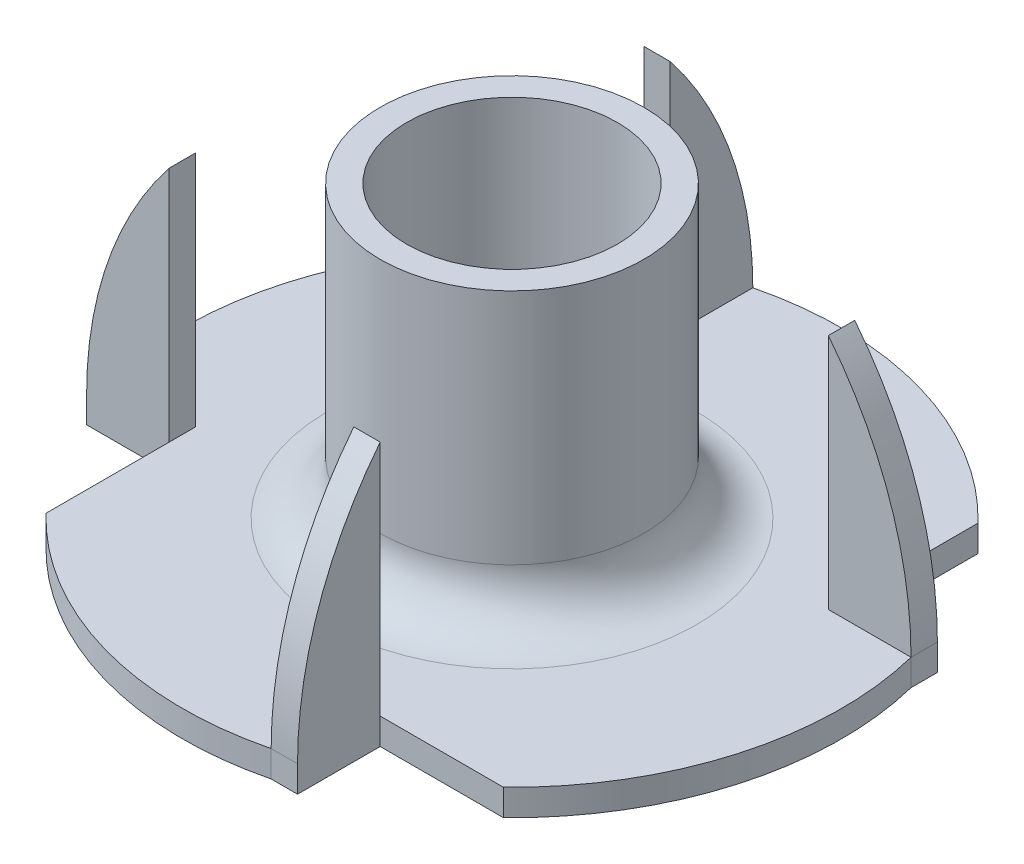
ISO-10303-21;
HEADER;
FILE_DESCRIPTION(('STEP AP214'),'2;1');
FILE_NAME('part.step','',(''),(''),'','','');
FILE_SCHEMA(('AUTOMOTIVE_DESIGN { 1 0 10303 214 1 1 1 1 }'));
ENDSEC;
DATA;
#1=APPLICATION_CONTEXT('core data for automotive mechanical design processes');
#2=APPLICATION_PROTOCOL_DEFINITION('international standard','automotive_design',2000,#1);
#3=PRODUCT_CONTEXT('',#1,'mechanical');
#4=PRODUCT('Part','Part','',(#3));
#5=PRODUCT_RELATED_PRODUCT_CATEGORY('part','',(#4));
#6=PRODUCT_DEFINITION_FORMATION('','',#4);
#7=PRODUCT_DEFINITION_CONTEXT('part definition',#1,'design');
#8=PRODUCT_DEFINITION('design','',#6,#7);
#9=PRODUCT_DEFINITION_SHAPE('','',#8);
#10=(LENGTH_UNIT() NAMED_UNIT(*) SI_UNIT(.MILLI.,.METRE.));
#11=(NAMED_UNIT(*) PLANE_ANGLE_UNIT() SI_UNIT($,.RADIAN.));
#12=(NAMED_UNIT(*) SI_UNIT($,.STERADIAN.) SOLID_ANGLE_UNIT());
#13=UNCERTAINTY_MEASURE_WITH_UNIT(LENGTH_MEASURE(1.E-05),#10,'distance_accuracy_value','');
#14=(GEOMETRIC_REPRESENTATION_CONTEXT(3) GLOBAL_UNCERTAINTY_ASSIGNED_CONTEXT((#13)) GLOBAL_UNIT_ASSIGNED_CONTEXT((#10,
#11,#12)) REPRESENTATION_CONTEXT('',''));
#15=CARTESIAN_POINT('',(0.,0.,0.));
#16=DIRECTION('',(0.,0.,1.));
#17=DIRECTION('',(1.,0.,0.));
#18=AXIS2_PLACEMENT_3D('',#15,#16,#17);
#19=CARTESIAN_POINT('',(0.,1.,-7.));
#20=DIRECTION('',(0.,-1.,0.));
#21=DIRECTION('',(0.,0.,-1.));
#22=AXIS2_PLACEMENT_3D('',#19,#20,#21);
#23=PLANE('',#22);
#24=CARTESIAN_POINT('',(0.,1.,0.));
#25=DIRECTION('',(0.,1.,0.));
#26=DIRECTION('',(0.,0.,1.));
#27=AXIS2_PLACEMENT_3D('',#24,#25,#26);
#28=CIRCLE('',#27,7.);
#29=CARTESIAN_POINT('',(0.,1.,7.));
#30=VERTEX_POINT('',#29);
#31=EDGE_CURVE('E431',#30,#30,#28,.T.);
#32=ORIENTED_EDGE('',*,*,#31,.F.);
#33=EDGE_LOOP('',(#32));
#34=FACE_BOUND('',#33,.T.);
#35=DIRECTION('',(0.,0.,1.));
#36=VECTOR('',#35,1.);
#37=CARTESIAN_POINT('',(8.99999999999975,1.,-2.99999999999987));
#38=LINE('',#37,#36);
#39=CARTESIAN_POINT('',(8.99999999999975,1.,-8.674675786449));
#40=VERTEX_POINT('',#39);
#41=CARTESIAN_POINT('',(8.99999999999975,1.,-4.00000000000013));
#42=VERTEX_POINT('',#41);
#43=EDGE_CURVE('E343',#40,#42,#38,.T.);
#44=ORIENTED_EDGE('',*,*,#43,.F.);
#45=CARTESIAN_POINT('',(0.,1.,0.));
#46=DIRECTION('',(0.,1.,0.));
#47=DIRECTION('',(0.,0.,1.));
#48=AXIS2_PLACEMENT_3D('',#45,#46,#47);
#49=CIRCLE('',#48,12.5);
#50=CARTESIAN_POINT('',(-3.00000000000009,1.,-12.1346610995121));
#51=VERTEX_POINT('',#50);
#52=EDGE_CURVE('E483',#40,#51,#49,.T.);
#53=ORIENTED_EDGE('',*,*,#52,.T.);
#54=DIRECTION('',(0.,0.,-1.));
#55=VECTOR('',#54,1.);
#56=CARTESIAN_POINT('',(-3.00000000000025,1.,-12.1346610995117));
#57=LINE('',#56,#55);
#58=CARTESIAN_POINT('',(-3.00000000000025,1.,-8.99999999999986));
#59=VERTEX_POINT('',#58);
#60=EDGE_CURVE('E413',#59,#51,#57,.T.);
#61=ORIENTED_EDGE('',*,*,#60,.F.);
#62=DIRECTION('',(1.,0.,0.));
#63=VECTOR('',#62,1.);
#64=CARTESIAN_POINT('',(-3.00000000000025,1.,-8.99999999999986));
#65=LINE('',#64,#63);
#66=CARTESIAN_POINT('',(-4.00000000000009,1.,-8.99999999999986));
#67=VERTEX_POINT('',#66);
#68=EDGE_CURVE('E67',#67,#59,#65,.T.);
#69=ORIENTED_EDGE('',*,*,#68,.F.);
#70=CARTESIAN_POINT('',(-8.67467578644938,1.,-8.99999999999986));
#71=VERTEX_POINT('',#70);
#72=EDGE_CURVE('E416',#71,#67,#65,.T.);
#73=ORIENTED_EDGE('',*,*,#72,.F.);
#74=CARTESIAN_POINT('',(-12.1346610995121,1.,3.00000000000013));
#75=VERTEX_POINT('',#74);
#76=EDGE_CURVE('E437',#71,#75,#49,.T.);
#77=ORIENTED_EDGE('',*,*,#76,.T.);
#78=DIRECTION('',(-1.,0.,0.));
#79=VECTOR('',#78,1.);
#80=CARTESIAN_POINT('',(-12.1346610995121,1.,3.00000000000014));
#81=LINE('',#80,#79);
#82=CARTESIAN_POINT('',(-9.00000000000025,1.,3.00000000000014));
#83=VERTEX_POINT('',#82);
#84=EDGE_CURVE('E394',#83,#75,#81,.T.);
#85=ORIENTED_EDGE('',*,*,#84,.F.);
#86=DIRECTION('',(0.,0.,-1.));
#87=VECTOR('',#86,1.);
#88=CARTESIAN_POINT('',(-9.00000000000025,1.,3.00000000000014));
#89=LINE('',#88,#87);
#90=CARTESIAN_POINT('',(-9.00000000000025,1.,4.00000000000013));
#91=VERTEX_POINT('',#90);
#92=EDGE_CURVE('E401',#91,#83,#89,.T.);
#93=ORIENTED_EDGE('',*,*,#92,.F.);
#94=CARTESIAN_POINT('',(-9.00000000000025,1.,8.67467578644927));
#95=VERTEX_POINT('',#94);
#96=EDGE_CURVE('E398',#95,#91,#89,.T.);
#97=ORIENTED_EDGE('',*,*,#96,.F.);
#98=CARTESIAN_POINT('',(3.,1.,12.1346610995122));
#99=VERTEX_POINT('',#98);
#100=EDGE_CURVE('E434',#95,#99,#49,.T.);
#101=ORIENTED_EDGE('',*,*,#100,.T.);
#102=DIRECTION('',(0.,0.,1.));
#103=VECTOR('',#102,1.);
#104=CARTESIAN_POINT('',(2.99999999999975,1.,12.134661099512));
#105=LINE('',#104,#103);
#106=CARTESIAN_POINT('',(2.99999999999975,1.,9.00000000000013));
#107=VERTEX_POINT('',#106);
#108=EDGE_CURVE('E376',#107,#99,#105,.T.);
#109=ORIENTED_EDGE('',*,*,#108,.F.);
#110=DIRECTION('',(-1.,0.,0.));
#111=VECTOR('',#110,1.);
#112=CARTESIAN_POINT('',(2.99999999999975,1.,9.00000000000013));
#113=LINE('',#112,#111);
#114=CARTESIAN_POINT('',(4.00000000000002,1.,9.00000000000013));
#115=VERTEX_POINT('',#114);
#116=EDGE_CURVE('E61',#115,#107,#113,.T.);
#117=ORIENTED_EDGE('',*,*,#116,.F.);
#118=CARTESIAN_POINT('',(8.67467578644888,1.,9.00000000000013));
#119=VERTEX_POINT('',#118);
#120=EDGE_CURVE('E379',#119,#115,#113,.T.);
#121=ORIENTED_EDGE('',*,*,#120,.F.);
#122=CARTESIAN_POINT('',(12.1346610995121,1.,-3.00000000000013));
#123=VERTEX_POINT('',#122);
#124=EDGE_CURVE('E438',#119,#123,#49,.T.);
#125=ORIENTED_EDGE('',*,*,#124,.T.);
#126=DIRECTION('',(1.,0.,0.));
#127=VECTOR('',#126,1.);
#128=CARTESIAN_POINT('',(12.1346610995116,1.,-2.99999999999987));
#129=LINE('',#128,#127);
#130=CARTESIAN_POINT('',(8.99999999999975,1.,-2.99999999999987));
#131=VERTEX_POINT('',#130);
#132=EDGE_CURVE('E346',#131,#123,#129,.T.);
#133=ORIENTED_EDGE('',*,*,#132,.F.);
#134=EDGE_CURVE('E349',#42,#131,#38,.T.);
#135=ORIENTED_EDGE('',*,*,#134,.F.);
#136=EDGE_LOOP('',(#44,#53,#61,#69,#73,#77,#85,#93,#97,#101,#109,#117,#121,#125,#133,#135));
#137=FACE_BOUND('',#136,.T.);
#138=ADVANCED_FACE('F44',(#34,#137),#23,.F.);
#139=CARTESIAN_POINT('',(0.,6.9664516560447,0.));
#140=DIRECTION('',(0.,1.,0.));
#141=DIRECTION('',(0.,0.,1.));
#142=AXIS2_PLACEMENT_3D('',#139,#140,#141);
#143=CYLINDRICAL_SURFACE('',#142,12.5);
#144=DIRECTION('',(0.,-1.,0.));
#145=VECTOR('',#144,1.);
#146=CARTESIAN_POINT('',(12.1346610995116,1.,-2.99999999999987));
#147=LINE('',#146,#145);
#148=CARTESIAN_POINT('',(12.1346610995116,0.,-2.99999999999987));
#149=VERTEX_POINT('',#148);
#150=EDGE_CURVE('E352',#123,#149,#147,.T.);
#151=ORIENTED_EDGE('',*,*,#150,.F.);
#152=ORIENTED_EDGE('',*,*,#124,.F.);
#153=DIRECTION('',(0.,-1.,0.));
#154=VECTOR('',#153,1.);
#155=CARTESIAN_POINT('',(8.67467578644888,1.,9.00000000000013));
#156=LINE('',#155,#154);
#157=CARTESIAN_POINT('',(8.67467578644888,0.,9.00000000000013));
#158=VERTEX_POINT('',#157);
#159=EDGE_CURVE('E370',#119,#158,#156,.T.);
#160=ORIENTED_EDGE('',*,*,#159,.T.);
#161=CARTESIAN_POINT('',(0.,0.,0.));
#162=DIRECTION('',(0.,1.,0.));
#163=DIRECTION('',(0.,0.,1.));
#164=AXIS2_PLACEMENT_3D('',#161,#162,#163);
#165=CIRCLE('',#164,12.5);
#166=EDGE_CURVE('E441',#158,#149,#165,.T.);
#167=ORIENTED_EDGE('',*,*,#166,.T.);
#168=EDGE_LOOP('',(#151,#152,#160,#167));
#169=FACE_BOUND('',#168,.T.);
#170=ADVANCED_FACE('F479',(#169),#143,.T.);
#171=DIRECTION('',(0.,-1.,0.));
#172=VECTOR('',#171,1.);
#173=CARTESIAN_POINT('',(2.99999999999975,1.,12.134661099512));
#174=LINE('',#173,#172);
#175=CARTESIAN_POINT('',(2.99999999999975,0.,12.134661099512));
#176=VERTEX_POINT('',#175);
#177=EDGE_CURVE('E371',#99,#176,#174,.T.);
#178=ORIENTED_EDGE('',*,*,#177,.F.);
#179=ORIENTED_EDGE('',*,*,#100,.F.);
#180=DIRECTION('',(0.,-1.,0.));
#181=VECTOR('',#180,1.);
#182=CARTESIAN_POINT('',(-9.00000000000025,1.,8.67467578644927));
#183=LINE('',#182,#181);
#184=CARTESIAN_POINT('',(-9.00000000000025,0.,8.67467578644927));
#185=VERTEX_POINT('',#184);
#186=EDGE_CURVE('E387',#95,#185,#183,.T.);
#187=ORIENTED_EDGE('',*,*,#186,.T.);
#188=EDGE_CURVE('E439',#185,#176,#165,.T.);
#189=ORIENTED_EDGE('',*,*,#188,.T.);
#190=EDGE_LOOP('',(#178,#179,#187,#189));
#191=FACE_BOUND('',#190,.T.);
#192=ADVANCED_FACE('F628',(#191),#143,.T.);
#193=DIRECTION('',(0.,-1.,0.));
#194=VECTOR('',#193,1.);
#195=CARTESIAN_POINT('',(-12.1346610995121,1.,3.00000000000014));
#196=LINE('',#195,#194);
#197=CARTESIAN_POINT('',(-12.1346610995121,0.,3.00000000000014));
#198=VERTEX_POINT('',#197);
#199=EDGE_CURVE('E388',#75,#198,#196,.T.);
#200=ORIENTED_EDGE('',*,*,#199,.F.);
#201=ORIENTED_EDGE('',*,*,#76,.F.);
#202=DIRECTION('',(0.,-1.,0.));
#203=VECTOR('',#202,1.);
#204=CARTESIAN_POINT('',(-8.67467578644938,1.,-8.99999999999986));
#205=LINE('',#204,#203);
#206=CARTESIAN_POINT('',(-8.67467578644938,0.,-8.99999999999986));
#207=VERTEX_POINT('',#206);
#208=EDGE_CURVE('E342',#71,#207,#205,.T.);
#209=ORIENTED_EDGE('',*,*,#208,.T.);
#210=EDGE_CURVE('E444',#207,#198,#165,.T.);
#211=ORIENTED_EDGE('',*,*,#210,.T.);
#212=EDGE_LOOP('',(#200,#201,#209,#211));
#213=FACE_BOUND('',#212,.T.);
#214=ADVANCED_FACE('F461',(#213),#143,.T.);
#215=CARTESIAN_POINT('',(0.,12.,-4.));
#216=DIRECTION('',(0.,-1.,0.));
#217=DIRECTION('',(0.,0.,-1.));
#218=AXIS2_PLACEMENT_3D('',#215,#216,#217);
#219=PLANE('',#218);
#220=CARTESIAN_POINT('',(0.,12.,0.));
#221=DIRECTION('',(0.,1.,0.));
#222=DIRECTION('',(0.,0.,1.));
#223=AXIS2_PLACEMENT_3D('',#220,#221,#222);
#224=CIRCLE('',#223,4.);
#225=CARTESIAN_POINT('',(0.,12.,4.));
#226=VERTEX_POINT('',#225);
#227=EDGE_CURVE('E11',#226,#226,#224,.T.);
#228=ORIENTED_EDGE('',*,*,#227,.F.);
#229=EDGE_LOOP('',(#228));
#230=FACE_BOUND('',#229,.T.);
#231=CARTESIAN_POINT('',(0.,12.,0.));
#232=DIRECTION('',(0.,1.,0.));
#233=DIRECTION('',(0.,0.,1.));
#234=AXIS2_PLACEMENT_3D('',#231,#232,#233);
#235=CIRCLE('',#234,5.);
#236=CARTESIAN_POINT('',(0.,12.,5.));
#237=VERTEX_POINT('',#236);
#238=EDGE_CURVE('E368',#237,#237,#235,.T.);
#239=ORIENTED_EDGE('',*,*,#238,.T.);
#240=EDGE_LOOP('',(#239));
#241=FACE_BOUND('',#240,.T.);
#242=ADVANCED_FACE('F50',(#230,#241),#219,.F.);
#243=CARTESIAN_POINT('',(0.,6.9664516560447,0.));
#244=DIRECTION('',(0.,1.,0.));
#245=DIRECTION('',(0.,0.,1.));
#246=AXIS2_PLACEMENT_3D('',#243,#244,#245);
#247=CYLINDRICAL_SURFACE('',#246,4.);
#248=CARTESIAN_POINT('',(0.,3.,0.));
#249=DIRECTION('',(0.,1.,0.));
#250=DIRECTION('',(0.,0.,1.));
#251=AXIS2_PLACEMENT_3D('',#248,#249,#250);
#252=CIRCLE('',#251,4.);
#253=CARTESIAN_POINT('',(0.,3.,4.));
#254=VERTEX_POINT('',#253);
#255=EDGE_CURVE('E53',#254,#254,#252,.T.);
#256=ORIENTED_EDGE('',*,*,#255,.F.);
#257=EDGE_LOOP('',(#256));
#258=FACE_BOUND('',#257,.T.);
#259=ORIENTED_EDGE('',*,*,#227,.T.);
#260=EDGE_LOOP('',(#259));
#261=FACE_BOUND('',#260,.T.);
#262=ADVANCED_FACE('F453',(#258,#261),#247,.F.);
#263=CARTESIAN_POINT('',(0.,3.,0.));
#264=DIRECTION('',(0.,1.,0.));
#265=DIRECTION('',(0.,0.,1.));
#266=AXIS2_PLACEMENT_3D('',#263,#264,#265);
#267=TOROIDAL_SURFACE('',#266,7.,3.);
#268=CARTESIAN_POINT('',(0.,0.,0.));
#269=DIRECTION('',(0.,1.,0.));
#270=DIRECTION('',(0.,0.,1.));
#271=AXIS2_PLACEMENT_3D('',#268,#269,#270);
#272=CIRCLE('',#271,7.);
#273=CARTESIAN_POINT('',(0.,0.,7.));
#274=VERTEX_POINT('',#273);
#275=EDGE_CURVE('E443',#274,#274,#272,.T.);
#276=ORIENTED_EDGE('',*,*,#275,.F.);
#277=EDGE_LOOP('',(#276));
#278=FACE_BOUND('',#277,.T.);
#279=ORIENTED_EDGE('',*,*,#255,.T.);
#280=EDGE_LOOP('',(#279));
#281=FACE_BOUND('',#280,.T.);
#282=ADVANCED_FACE('F455',(#278,#281),#267,.T.);
#283=CARTESIAN_POINT('',(0.,0.,-7.));
#284=DIRECTION('',(0.,1.,0.));
#285=DIRECTION('',(0.,0.,1.));
#286=AXIS2_PLACEMENT_3D('',#283,#284,#285);
#287=PLANE('',#286);
#288=DIRECTION('',(0.,0.,1.));
#289=VECTOR('',#288,1.);
#290=CARTESIAN_POINT('',(8.99999999999975,0.,-2.99999999999987));
#291=LINE('',#290,#289);
#292=CARTESIAN_POINT('',(8.99999999999975,0.,-8.674675786449));
#293=VERTEX_POINT('',#292);
#294=CARTESIAN_POINT('',(8.99999999999975,0.,-4.00000000000013));
#295=VERTEX_POINT('',#294);
#296=EDGE_CURVE('E353',#293,#295,#291,.T.);
#297=ORIENTED_EDGE('',*,*,#296,.T.);
#298=DIRECTION('',(-1.,0.,0.));
#299=VECTOR('',#298,1.);
#300=CARTESIAN_POINT('',(9.00000000000025,0.,-4.00000000000013));
#301=LINE('',#300,#299);
#302=CARTESIAN_POINT('',(12.1346610995121,0.,-4.00000000000013));
#303=VERTEX_POINT('',#302);
#304=EDGE_CURVE('E242',#303,#295,#301,.T.);
#305=ORIENTED_EDGE('',*,*,#304,.F.);
#306=DIRECTION('',(0.,0.,1.));
#307=VECTOR('',#306,1.);
#308=CARTESIAN_POINT('',(12.1346610995121,0.,-4.00000000000013));
#309=LINE('',#308,#307);
#310=EDGE_CURVE('E259',#303,#149,#309,.T.);
#311=ORIENTED_EDGE('',*,*,#310,.T.);
#312=ORIENTED_EDGE('',*,*,#166,.F.);
#313=DIRECTION('',(-1.,0.,0.));
#314=VECTOR('',#313,1.);
#315=CARTESIAN_POINT('',(2.99999999999975,0.,9.00000000000013));
#316=LINE('',#315,#314);
#317=CARTESIAN_POINT('',(4.00000000000002,0.,9.00000000000013));
#318=VERTEX_POINT('',#317);
#319=EDGE_CURVE('E357',#158,#318,#316,.T.);
#320=ORIENTED_EDGE('',*,*,#319,.T.);
#321=DIRECTION('',(0.,0.,-1.));
#322=VECTOR('',#321,1.);
#323=CARTESIAN_POINT('',(4.00000000000004,0.,9.00000000000029));
#324=LINE('',#323,#322);
#325=CARTESIAN_POINT('',(4.,0.,12.1346610995122));
#326=VERTEX_POINT('',#325);
#327=EDGE_CURVE('E280',#326,#318,#324,.T.);
#328=ORIENTED_EDGE('',*,*,#327,.F.);
#329=DIRECTION('',(-1.,0.,0.));
#330=VECTOR('',#329,1.);
#331=CARTESIAN_POINT('',(4.,0.,12.1346610995122));
#332=LINE('',#331,#330);
#333=EDGE_CURVE('E291',#326,#176,#332,.T.);
#334=ORIENTED_EDGE('',*,*,#333,.T.);
#335=ORIENTED_EDGE('',*,*,#188,.F.);
#336=DIRECTION('',(0.,0.,-1.));
#337=VECTOR('',#336,1.);
#338=CARTESIAN_POINT('',(-9.00000000000025,0.,3.00000000000014));
#339=LINE('',#338,#337);
#340=CARTESIAN_POINT('',(-9.00000000000025,0.,4.00000000000013));
#341=VERTEX_POINT('',#340);
#342=EDGE_CURVE('E375',#185,#341,#339,.T.);
#343=ORIENTED_EDGE('',*,*,#342,.T.);
#344=DIRECTION('',(1.,0.,0.));
#345=VECTOR('',#344,1.);
#346=CARTESIAN_POINT('',(-9.00000000000025,0.,4.00000000000013));
#347=LINE('',#346,#345);
#348=CARTESIAN_POINT('',(-12.1346610995121,0.,4.00000000000013));
#349=VERTEX_POINT('',#348);
#350=EDGE_CURVE('E309',#349,#341,#347,.T.);
#351=ORIENTED_EDGE('',*,*,#350,.F.);
#352=DIRECTION('',(0.,0.,-1.));
#353=VECTOR('',#352,1.);
#354=CARTESIAN_POINT('',(-12.1346610995121,0.,4.00000000000013));
#355=LINE('',#354,#353);
#356=EDGE_CURVE('E326',#349,#198,#355,.T.);
#357=ORIENTED_EDGE('',*,*,#356,.T.);
#358=ORIENTED_EDGE('',*,*,#210,.F.);
#359=DIRECTION('',(1.,0.,0.));
#360=VECTOR('',#359,1.);
#361=CARTESIAN_POINT('',(-3.00000000000025,0.,-8.99999999999986));
#362=LINE('',#361,#360);
#363=CARTESIAN_POINT('',(-4.00000000000009,0.,-8.99999999999986));
#364=VERTEX_POINT('',#363);
#365=EDGE_CURVE('E391',#207,#364,#362,.T.);
#366=ORIENTED_EDGE('',*,*,#365,.T.);
#367=DIRECTION('',(0.,0.,1.));
#368=VECTOR('',#367,1.);
#369=CARTESIAN_POINT('',(-4.0000000000001,0.,-9.00000000000026));
#370=LINE('',#369,#368);
#371=CARTESIAN_POINT('',(-4.00000000000009,0.,-12.1346610995121));
#372=VERTEX_POINT('',#371);
#373=EDGE_CURVE('E206',#372,#364,#370,.T.);
#374=ORIENTED_EDGE('',*,*,#373,.F.);
#375=DIRECTION('',(1.,0.,0.));
#376=VECTOR('',#375,1.);
#377=CARTESIAN_POINT('',(-4.00000000000009,0.,-12.1346610995121));
#378=LINE('',#377,#376);
#379=CARTESIAN_POINT('',(-3.00000000000025,0.,-12.1346610995117));
#380=VERTEX_POINT('',#379);
#381=EDGE_CURVE('E227',#372,#380,#378,.T.);
#382=ORIENTED_EDGE('',*,*,#381,.T.);
#383=EDGE_CURVE('E580',#293,#380,#165,.T.);
#384=ORIENTED_EDGE('',*,*,#383,.F.);
#385=EDGE_LOOP('',(#297,#305,#311,#312,#320,#328,#334,#335,#343,#351,#357,#358,#366,#374,#382,#384));
#386=FACE_BOUND('',#385,.T.);
#387=ORIENTED_EDGE('',*,*,#275,.T.);
#388=EDGE_LOOP('',(#387));
#389=FACE_BOUND('',#388,.T.);
#390=ADVANCED_FACE('F547',(#386,#389),#287,.F.);
#391=ORIENTED_EDGE('',*,*,#52,.F.);
#392=DIRECTION('',(0.,-1.,0.));
#393=VECTOR('',#392,1.);
#394=CARTESIAN_POINT('',(8.99999999999975,1.,-8.674675786449));
#395=LINE('',#394,#393);
#396=EDGE_CURVE('E362',#40,#293,#395,.T.);
#397=ORIENTED_EDGE('',*,*,#396,.T.);
#398=ORIENTED_EDGE('',*,*,#383,.T.);
#399=DIRECTION('',(0.,-1.,0.));
#400=VECTOR('',#399,1.);
#401=CARTESIAN_POINT('',(-3.00000000000025,1.,-12.1346610995117));
#402=LINE('',#401,#400);
#403=EDGE_CURVE('E409',#51,#380,#402,.T.);
#404=ORIENTED_EDGE('',*,*,#403,.F.);
#405=EDGE_LOOP('',(#391,#397,#398,#404));
#406=FACE_BOUND('',#405,.T.);
#407=ADVANCED_FACE('F475',(#406),#143,.T.);
#408=CARTESIAN_POINT('',(0.,3.,0.));
#409=DIRECTION('',(0.,1.,0.));
#410=DIRECTION('',(0.,0.,1.));
#411=AXIS2_PLACEMENT_3D('',#408,#409,#410);
#412=TOROIDAL_SURFACE('',#411,7.,2.);
#413=CARTESIAN_POINT('',(0.,3.,0.));
#414=DIRECTION('',(0.,1.,0.));
#415=DIRECTION('',(0.,0.,1.));
#416=AXIS2_PLACEMENT_3D('',#413,#414,#415);
#417=CIRCLE('',#416,5.);
#418=CARTESIAN_POINT('',(0.,3.,5.));
#419=VERTEX_POINT('',#418);
#420=EDGE_CURVE('E430',#419,#419,#417,.T.);
#421=ORIENTED_EDGE('',*,*,#420,.F.);
#422=EDGE_LOOP('',(#421));
#423=FACE_BOUND('',#422,.T.);
#424=ORIENTED_EDGE('',*,*,#31,.T.);
#425=EDGE_LOOP('',(#424));
#426=FACE_BOUND('',#425,.T.);
#427=ADVANCED_FACE('F467',(#423,#426),#412,.F.);
#428=CARTESIAN_POINT('',(0.,6.9664516560447,0.));
#429=DIRECTION('',(0.,1.,0.));
#430=DIRECTION('',(0.,0.,1.));
#431=AXIS2_PLACEMENT_3D('',#428,#429,#430);
#432=CYLINDRICAL_SURFACE('',#431,5.);
#433=ORIENTED_EDGE('',*,*,#238,.F.);
#434=EDGE_LOOP('',(#433));
#435=FACE_BOUND('',#434,.T.);
#436=ORIENTED_EDGE('',*,*,#420,.T.);
#437=EDGE_LOOP('',(#436));
#438=FACE_BOUND('',#437,.T.);
#439=ADVANCED_FACE('F463',(#435,#438),#432,.T.);
#440=CARTESIAN_POINT('',(-3.00000000000025,1.,-8.99999999999986));
#441=DIRECTION('',(0.,0.,-1.));
#442=DIRECTION('',(-1.,0.,0.));
#443=AXIS2_PLACEMENT_3D('',#440,#441,#442);
#444=PLANE('',#443);
#445=DIRECTION('',(0.,1.,0.));
#446=VECTOR('',#445,1.);
#447=CARTESIAN_POINT('',(-4.0000000000001,0.,-9.00000000000026));
#448=LINE('',#447,#446);
#449=EDGE_CURVE('E201',#364,#67,#448,.T.);
#450=ORIENTED_EDGE('',*,*,#449,.F.);
#451=ORIENTED_EDGE('',*,*,#365,.F.);
#452=ORIENTED_EDGE('',*,*,#208,.F.);
#453=ORIENTED_EDGE('',*,*,#72,.T.);
#454=EDGE_LOOP('',(#450,#451,#452,#453));
#455=FACE_BOUND('',#454,.T.);
#456=ADVANCED_FACE('F470',(#455),#444,.T.);
#457=CARTESIAN_POINT('',(-9.00000000000025,1.,3.00000000000014));
#458=DIRECTION('',(-1.,0.,0.));
#459=DIRECTION('',(0.,0.,1.));
#460=AXIS2_PLACEMENT_3D('',#457,#458,#459);
#461=PLANE('',#460);
#462=DIRECTION('',(0.,1.,0.));
#463=VECTOR('',#462,1.);
#464=CARTESIAN_POINT('',(-9.00000000000025,0.,4.00000000000013));
#465=LINE('',#464,#463);
#466=EDGE_CURVE('E316',#341,#91,#465,.T.);
#467=ORIENTED_EDGE('',*,*,#466,.F.);
#468=ORIENTED_EDGE('',*,*,#342,.F.);
#469=ORIENTED_EDGE('',*,*,#186,.F.);
#470=ORIENTED_EDGE('',*,*,#96,.T.);
#471=EDGE_LOOP('',(#467,#468,#469,#470));
#472=FACE_BOUND('',#471,.T.);
#473=ADVANCED_FACE('F589',(#472),#461,.T.);
#474=CARTESIAN_POINT('',(2.99999999999975,1.,9.00000000000013));
#475=DIRECTION('',(0.,0.,1.));
#476=DIRECTION('',(1.,0.,0.));
#477=AXIS2_PLACEMENT_3D('',#474,#475,#476);
#478=PLANE('',#477);
#479=DIRECTION('',(0.,1.,0.));
#480=VECTOR('',#479,1.);
#481=CARTESIAN_POINT('',(4.00000000000004,0.,9.00000000000029));
#482=LINE('',#481,#480);
#483=EDGE_CURVE('E282',#318,#115,#482,.T.);
#484=ORIENTED_EDGE('',*,*,#483,.F.);
#485=ORIENTED_EDGE('',*,*,#319,.F.);
#486=ORIENTED_EDGE('',*,*,#159,.F.);
#487=ORIENTED_EDGE('',*,*,#120,.T.);
#488=EDGE_LOOP('',(#484,#485,#486,#487));
#489=FACE_BOUND('',#488,.T.);
#490=ADVANCED_FACE('F554',(#489),#478,.T.);
#491=CARTESIAN_POINT('',(8.99999999999975,1.,-2.99999999999987));
#492=DIRECTION('',(1.,0.,0.));
#493=DIRECTION('',(0.,0.,-1.));
#494=AXIS2_PLACEMENT_3D('',#491,#492,#493);
#495=PLANE('',#494);
#496=DIRECTION('',(0.,1.,0.));
#497=VECTOR('',#496,1.);
#498=CARTESIAN_POINT('',(9.00000000000025,0.,-4.00000000000013));
#499=LINE('',#498,#497);
#500=EDGE_CURVE('E248',#295,#42,#499,.T.);
#501=ORIENTED_EDGE('',*,*,#500,.F.);
#502=ORIENTED_EDGE('',*,*,#296,.F.);
#503=ORIENTED_EDGE('',*,*,#396,.F.);
#504=ORIENTED_EDGE('',*,*,#43,.T.);
#505=EDGE_LOOP('',(#501,#502,#503,#504));
#506=FACE_BOUND('',#505,.T.);
#507=ADVANCED_FACE('F576',(#506),#495,.T.);
#508=CARTESIAN_POINT('',(-9.00000000000025,0.,4.00000000000013));
#509=DIRECTION('',(-1.,0.,0.));
#510=DIRECTION('',(0.,0.,1.));
#511=AXIS2_PLACEMENT_3D('',#508,#509,#510);
#512=PLANE('',#511);
#513=CARTESIAN_POINT('',(-9.00000000000025,10.,4.00000000000013));
#514=VERTEX_POINT('',#513);
#515=EDGE_CURVE('E314',#91,#514,#465,.T.);
#516=ORIENTED_EDGE('',*,*,#515,.F.);
#517=ORIENTED_EDGE('',*,*,#92,.T.);
#518=DIRECTION('',(0.,1.,0.));
#519=VECTOR('',#518,1.);
#520=CARTESIAN_POINT('',(-9.00000000000025,0.,3.00000000000013));
#521=LINE('',#520,#519);
#522=CARTESIAN_POINT('',(-9.00000000000025,10.,3.00000000000013));
#523=VERTEX_POINT('',#522);
#524=EDGE_CURVE('E220',#83,#523,#521,.T.);
#525=ORIENTED_EDGE('',*,*,#524,.T.);
#526=DIRECTION('',(0.,0.,-1.));
#527=VECTOR('',#526,1.);
#528=CARTESIAN_POINT('',(-9.00000000000025,10.,4.00000000000013));
#529=LINE('',#528,#527);
#530=EDGE_CURVE('E338',#514,#523,#529,.T.);
#531=ORIENTED_EDGE('',*,*,#530,.F.);
#532=EDGE_LOOP('',(#516,#517,#525,#531));
#533=FACE_BOUND('',#532,.T.);
#534=ADVANCED_FACE('F520',(#533),#512,.F.);
#535=CARTESIAN_POINT('',(2.35272642428368,1.,3.00000000000013));
#536=DIRECTION('',(0.,0.,-1.));
#537=DIRECTION('',(-1.,0.,0.));
#538=AXIS2_PLACEMENT_3D('',#535,#536,#537);
#539=PLANE('',#538);
#540=ORIENTED_EDGE('',*,*,#84,.T.);
#541=CARTESIAN_POINT('',(2.35272642428368,1.,3.00000000000013));
#542=DIRECTION('',(0.,0.,1.));
#543=DIRECTION('',(-1.,0.,0.));
#544=AXIS2_PLACEMENT_3D('',#541,#542,#543);
#545=CIRCLE('',#544,14.4873875237958);
#546=EDGE_CURVE('E312',#523,#75,#545,.T.);
#547=ORIENTED_EDGE('',*,*,#546,.F.);
#548=ORIENTED_EDGE('',*,*,#524,.F.);
#549=EDGE_LOOP('',(#540,#547,#548));
#550=FACE_BOUND('',#549,.T.);
#551=ADVANCED_FACE('F502',(#550),#539,.T.);
#552=CARTESIAN_POINT('',(2.35272642428368,1.,4.00000000000013));
#553=DIRECTION('',(0.,0.,-1.));
#554=DIRECTION('',(-1.,0.,0.));
#555=AXIS2_PLACEMENT_3D('',#552,#553,#554);
#556=CYLINDRICAL_SURFACE('',#555,14.4873875237958);
#557=ORIENTED_EDGE('',*,*,#546,.T.);
#558=DIRECTION('',(0.,0.,-1.));
#559=VECTOR('',#558,1.);
#560=CARTESIAN_POINT('',(-12.1346610995121,1.,4.00000000000013));
#561=LINE('',#560,#559);
#562=CARTESIAN_POINT('',(-12.1346610995121,1.,4.00000000000013));
#563=VERTEX_POINT('',#562);
#564=EDGE_CURVE('E333',#563,#75,#561,.T.);
#565=ORIENTED_EDGE('',*,*,#564,.F.);
#566=CARTESIAN_POINT('',(2.35272642428368,1.,4.00000000000013));
#567=DIRECTION('',(0.,0.,1.));
#568=DIRECTION('',(-1.,0.,0.));
#569=AXIS2_PLACEMENT_3D('',#566,#567,#568);
#570=CIRCLE('',#569,14.4873875237958);
#571=EDGE_CURVE('E319',#514,#563,#570,.T.);
#572=ORIENTED_EDGE('',*,*,#571,.F.);
#573=ORIENTED_EDGE('',*,*,#530,.T.);
#574=EDGE_LOOP('',(#557,#565,#572,#573));
#575=FACE_BOUND('',#574,.T.);
#576=ADVANCED_FACE('F506',(#575),#556,.T.);
#577=CARTESIAN_POINT('',(-12.1346610995121,0.,4.00000000000013));
#578=DIRECTION('',(1.,0.,0.));
#579=DIRECTION('',(0.,0.,-1.));
#580=AXIS2_PLACEMENT_3D('',#577,#578,#579);
#581=PLANE('',#580);
#582=ORIENTED_EDGE('',*,*,#199,.T.);
#583=ORIENTED_EDGE('',*,*,#356,.F.);
#584=DIRECTION('',(0.,-1.,0.));
#585=VECTOR('',#584,1.);
#586=CARTESIAN_POINT('',(-12.1346610995121,0.,4.00000000000013));
#587=LINE('',#586,#585);
#588=EDGE_CURVE('E323',#563,#349,#587,.T.);
#589=ORIENTED_EDGE('',*,*,#588,.F.);
#590=ORIENTED_EDGE('',*,*,#564,.T.);
#591=EDGE_LOOP('',(#582,#583,#589,#590));
#592=FACE_BOUND('',#591,.T.);
#593=ADVANCED_FACE('F509',(#592),#581,.F.);
#594=CARTESIAN_POINT('',(2.35272642428368,1.,4.00000000000013));
#595=DIRECTION('',(0.,0.,-1.));
#596=DIRECTION('',(-1.,0.,0.));
#597=AXIS2_PLACEMENT_3D('',#594,#595,#596);
#598=PLANE('',#597);
#599=ORIENTED_EDGE('',*,*,#350,.T.);
#600=ORIENTED_EDGE('',*,*,#466,.T.);
#601=ORIENTED_EDGE('',*,*,#515,.T.);
#602=ORIENTED_EDGE('',*,*,#571,.T.);
#603=ORIENTED_EDGE('',*,*,#588,.T.);
#604=EDGE_LOOP('',(#599,#600,#601,#602,#603));
#605=FACE_BOUND('',#604,.T.);
#606=ADVANCED_FACE('F511',(#605),#598,.F.);
#607=CARTESIAN_POINT('',(4.00000000000004,0.,9.00000000000029));
#608=DIRECTION('',(0.,0.,1.));
#609=DIRECTION('',(1.,0.,0.));
#610=AXIS2_PLACEMENT_3D('',#607,#608,#609);
#611=PLANE('',#610);
#612=CARTESIAN_POINT('',(4.00000000000004,10.,9.00000000000029));
#613=VERTEX_POINT('',#612);
#614=EDGE_CURVE('E281',#115,#613,#482,.T.);
#615=ORIENTED_EDGE('',*,*,#614,.F.);
#616=ORIENTED_EDGE('',*,*,#116,.T.);
#617=DIRECTION('',(0.,1.,0.));
#618=VECTOR('',#617,1.);
#619=CARTESIAN_POINT('',(3.00000000000004,0.,9.00000000000028));
#620=LINE('',#619,#618);
#621=CARTESIAN_POINT('',(3.00000000000004,10.,9.00000000000028));
#622=VERTEX_POINT('',#621);
#623=EDGE_CURVE('E294',#107,#622,#620,.T.);
#624=ORIENTED_EDGE('',*,*,#623,.T.);
#625=DIRECTION('',(-1.,0.,0.));
#626=VECTOR('',#625,1.);
#627=CARTESIAN_POINT('',(4.00000000000004,10.,9.00000000000029));
#628=LINE('',#627,#626);
#629=EDGE_CURVE('E263',#613,#622,#628,.T.);
#630=ORIENTED_EDGE('',*,*,#629,.F.);
#631=EDGE_LOOP('',(#615,#616,#624,#630));
#632=FACE_BOUND('',#631,.T.);
#633=ADVANCED_FACE('F538',(#632),#611,.F.);
#634=CARTESIAN_POINT('',(3.00000000000016,1.,-2.35272642428365));
#635=DIRECTION('',(-1.,0.,0.));
#636=DIRECTION('',(0.,0.,1.));
#637=AXIS2_PLACEMENT_3D('',#634,#635,#636);
#638=PLANE('',#637);
#639=ORIENTED_EDGE('',*,*,#108,.T.);
#640=CARTESIAN_POINT('',(3.00000000000016,1.,-2.35272642428365));
#641=DIRECTION('',(1.,0.,0.));
#642=DIRECTION('',(0.,0.,1.));
#643=AXIS2_PLACEMENT_3D('',#640,#641,#642);
#644=CIRCLE('',#643,14.4873875237958);
#645=EDGE_CURVE('E285',#622,#99,#644,.T.);
#646=ORIENTED_EDGE('',*,*,#645,.F.);
#647=ORIENTED_EDGE('',*,*,#623,.F.);
#648=EDGE_LOOP('',(#639,#646,#647));
#649=FACE_BOUND('',#648,.T.);
#650=ADVANCED_FACE('F742',(#649),#638,.T.);
#651=CARTESIAN_POINT('',(4.00000000000016,1.,-2.35272642428364));
#652=DIRECTION('',(-1.,0.,0.));
#653=DIRECTION('',(0.,0.,1.));
#654=AXIS2_PLACEMENT_3D('',#651,#652,#653);
#655=CYLINDRICAL_SURFACE('',#654,14.4873875237958);
#656=ORIENTED_EDGE('',*,*,#645,.T.);
#657=DIRECTION('',(-1.,0.,0.));
#658=VECTOR('',#657,1.);
#659=CARTESIAN_POINT('',(4.,1.,12.1346610995122));
#660=LINE('',#659,#658);
#661=CARTESIAN_POINT('',(4.,1.,12.1346610995122));
#662=VERTEX_POINT('',#661);
#663=EDGE_CURVE('E302',#662,#99,#660,.T.);
#664=ORIENTED_EDGE('',*,*,#663,.F.);
#665=CARTESIAN_POINT('',(4.00000000000016,1.,-2.35272642428364));
#666=DIRECTION('',(1.,0.,0.));
#667=DIRECTION('',(0.,0.,1.));
#668=AXIS2_PLACEMENT_3D('',#665,#666,#667);
#669=CIRCLE('',#668,14.4873875237958);
#670=EDGE_CURVE('E290',#613,#662,#669,.T.);
#671=ORIENTED_EDGE('',*,*,#670,.F.);
#672=ORIENTED_EDGE('',*,*,#629,.T.);
#673=EDGE_LOOP('',(#656,#664,#671,#672));
#674=FACE_BOUND('',#673,.T.);
#675=ADVANCED_FACE('F545',(#674),#655,.T.);
#676=CARTESIAN_POINT('',(4.,0.,12.1346610995122));
#677=DIRECTION('',(0.,0.,-1.));
#678=DIRECTION('',(-1.,0.,0.));
#679=AXIS2_PLACEMENT_3D('',#676,#677,#678);
#680=PLANE('',#679);
#681=ORIENTED_EDGE('',*,*,#177,.T.);
#682=ORIENTED_EDGE('',*,*,#333,.F.);
#683=DIRECTION('',(0.,-1.,0.));
#684=VECTOR('',#683,1.);
#685=CARTESIAN_POINT('',(4.,0.,12.1346610995122));
#686=LINE('',#685,#684);
#687=EDGE_CURVE('E289',#662,#326,#686,.T.);
#688=ORIENTED_EDGE('',*,*,#687,.F.);
#689=ORIENTED_EDGE('',*,*,#663,.T.);
#690=EDGE_LOOP('',(#681,#682,#688,#689));
#691=FACE_BOUND('',#690,.T.);
#692=ADVANCED_FACE('F546',(#691),#680,.F.);
#693=CARTESIAN_POINT('',(4.00000000000016,1.,-2.35272642428364));
#694=DIRECTION('',(-1.,0.,0.));
#695=DIRECTION('',(0.,0.,1.));
#696=AXIS2_PLACEMENT_3D('',#693,#694,#695);
#697=PLANE('',#696);
#698=ORIENTED_EDGE('',*,*,#327,.T.);
#699=ORIENTED_EDGE('',*,*,#483,.T.);
#700=ORIENTED_EDGE('',*,*,#614,.T.);
#701=ORIENTED_EDGE('',*,*,#670,.T.);
#702=ORIENTED_EDGE('',*,*,#687,.T.);
#703=EDGE_LOOP('',(#698,#699,#700,#701,#702));
#704=FACE_BOUND('',#703,.T.);
#705=ADVANCED_FACE('F534',(#704),#697,.F.);
#706=CARTESIAN_POINT('',(9.00000000000025,0.,-4.00000000000013));
#707=DIRECTION('',(1.,0.,0.));
#708=DIRECTION('',(0.,0.,-1.));
#709=AXIS2_PLACEMENT_3D('',#706,#707,#708);
#710=PLANE('',#709);
#711=CARTESIAN_POINT('',(9.00000000000025,10.,-4.00000000000013));
#712=VERTEX_POINT('',#711);
#713=EDGE_CURVE('E250',#42,#712,#499,.T.);
#714=ORIENTED_EDGE('',*,*,#713,.F.);
#715=ORIENTED_EDGE('',*,*,#134,.T.);
#716=DIRECTION('',(0.,1.,0.));
#717=VECTOR('',#716,1.);
#718=CARTESIAN_POINT('',(9.00000000000025,0.,-3.00000000000013));
#719=LINE('',#718,#717);
#720=CARTESIAN_POINT('',(9.00000000000025,10.,-3.00000000000013));
#721=VERTEX_POINT('',#720);
#722=EDGE_CURVE('E257',#131,#721,#719,.T.);
#723=ORIENTED_EDGE('',*,*,#722,.T.);
#724=DIRECTION('',(0.,0.,1.));
#725=VECTOR('',#724,1.);
#726=CARTESIAN_POINT('',(9.00000000000025,10.,-4.00000000000013));
#727=LINE('',#726,#725);
#728=EDGE_CURVE('E234',#712,#721,#727,.T.);
#729=ORIENTED_EDGE('',*,*,#728,.F.);
#730=EDGE_LOOP('',(#714,#715,#723,#729));
#731=FACE_BOUND('',#730,.T.);
#732=ADVANCED_FACE('F561',(#731),#710,.F.);
#733=CARTESIAN_POINT('',(-2.35272642428368,1.,-3.00000000000013));
#734=DIRECTION('',(0.,0.,1.));
#735=DIRECTION('',(1.,0.,0.));
#736=AXIS2_PLACEMENT_3D('',#733,#734,#735);
#737=PLANE('',#736);
#738=ORIENTED_EDGE('',*,*,#132,.T.);
#739=CARTESIAN_POINT('',(-2.35272642428368,1.,-3.00000000000013));
#740=DIRECTION('',(0.,0.,-1.));
#741=DIRECTION('',(1.,0.,0.));
#742=AXIS2_PLACEMENT_3D('',#739,#740,#741);
#743=CIRCLE('',#742,14.4873875237958);
#744=EDGE_CURVE('E247',#721,#123,#743,.T.);
#745=ORIENTED_EDGE('',*,*,#744,.F.);
#746=ORIENTED_EDGE('',*,*,#722,.F.);
#747=EDGE_LOOP('',(#738,#745,#746));
#748=FACE_BOUND('',#747,.T.);
#749=ADVANCED_FACE('F563',(#748),#737,.T.);
#750=CARTESIAN_POINT('',(-2.35272642428368,1.,-4.00000000000013));
#751=DIRECTION('',(0.,0.,1.));
#752=DIRECTION('',(1.,0.,0.));
#753=AXIS2_PLACEMENT_3D('',#750,#751,#752);
#754=CYLINDRICAL_SURFACE('',#753,14.4873875237958);
#755=ORIENTED_EDGE('',*,*,#744,.T.);
#756=DIRECTION('',(0.,0.,1.));
#757=VECTOR('',#756,1.);
#758=CARTESIAN_POINT('',(12.1346610995121,1.,-4.00000000000013));
#759=LINE('',#758,#757);
#760=CARTESIAN_POINT('',(12.1346610995121,1.,-4.00000000000013));
#761=VERTEX_POINT('',#760);
#762=EDGE_CURVE('E269',#761,#123,#759,.T.);
#763=ORIENTED_EDGE('',*,*,#762,.F.);
#764=CARTESIAN_POINT('',(-2.35272642428368,1.,-4.00000000000013));
#765=DIRECTION('',(0.,0.,-1.));
#766=DIRECTION('',(1.,0.,0.));
#767=AXIS2_PLACEMENT_3D('',#764,#765,#766);
#768=CIRCLE('',#767,14.4873875237958);
#769=EDGE_CURVE('E251',#712,#761,#768,.T.);
#770=ORIENTED_EDGE('',*,*,#769,.F.);
#771=ORIENTED_EDGE('',*,*,#728,.T.);
#772=EDGE_LOOP('',(#755,#763,#770,#771));
#773=FACE_BOUND('',#772,.T.);
#774=ADVANCED_FACE('F570',(#773),#754,.T.);
#775=CARTESIAN_POINT('',(12.1346610995121,0.,-4.00000000000013));
#776=DIRECTION('',(-1.,0.,0.));
#777=DIRECTION('',(0.,0.,1.));
#778=AXIS2_PLACEMENT_3D('',#775,#776,#777);
#779=PLANE('',#778);
#780=ORIENTED_EDGE('',*,*,#150,.T.);
#781=ORIENTED_EDGE('',*,*,#310,.F.);
#782=DIRECTION('',(0.,-1.,0.));
#783=VECTOR('',#782,1.);
#784=CARTESIAN_POINT('',(12.1346610995121,0.,-4.00000000000013));
#785=LINE('',#784,#783);
#786=EDGE_CURVE('E258',#761,#303,#785,.T.);
#787=ORIENTED_EDGE('',*,*,#786,.F.);
#788=ORIENTED_EDGE('',*,*,#762,.T.);
#789=EDGE_LOOP('',(#780,#781,#787,#788));
#790=FACE_BOUND('',#789,.T.);
#791=ADVANCED_FACE('F571',(#790),#779,.F.);
#792=CARTESIAN_POINT('',(-2.35272642428368,1.,-4.00000000000013));
#793=DIRECTION('',(0.,0.,1.));
#794=DIRECTION('',(1.,0.,0.));
#795=AXIS2_PLACEMENT_3D('',#792,#793,#794);
#796=PLANE('',#795);
#797=ORIENTED_EDGE('',*,*,#304,.T.);
#798=ORIENTED_EDGE('',*,*,#500,.T.);
#799=ORIENTED_EDGE('',*,*,#713,.T.);
#800=ORIENTED_EDGE('',*,*,#769,.T.);
#801=ORIENTED_EDGE('',*,*,#786,.T.);
#802=EDGE_LOOP('',(#797,#798,#799,#800,#801));
#803=FACE_BOUND('',#802,.T.);
#804=ADVANCED_FACE('F574',(#803),#796,.F.);
#805=CARTESIAN_POINT('',(-4.0000000000001,0.,-9.00000000000026));
#806=DIRECTION('',(0.,0.,-1.));
#807=DIRECTION('',(-1.,0.,0.));
#808=AXIS2_PLACEMENT_3D('',#805,#806,#807);
#809=PLANE('',#808);
#810=CARTESIAN_POINT('',(-4.0000000000001,10.,-9.00000000000026));
#811=VERTEX_POINT('',#810);
#812=EDGE_CURVE('E198',#67,#811,#448,.T.);
#813=ORIENTED_EDGE('',*,*,#812,.F.);
#814=ORIENTED_EDGE('',*,*,#68,.T.);
#815=DIRECTION('',(0.,1.,0.));
#816=VECTOR('',#815,1.);
#817=CARTESIAN_POINT('',(-3.0000000000001,0.,-9.00000000000026));
#818=LINE('',#817,#816);
#819=CARTESIAN_POINT('',(-3.0000000000001,10.,-9.00000000000026));
#820=VERTEX_POINT('',#819);
#821=EDGE_CURVE('E215',#59,#820,#818,.T.);
#822=ORIENTED_EDGE('',*,*,#821,.T.);
#823=DIRECTION('',(1.,0.,0.));
#824=VECTOR('',#823,1.);
#825=CARTESIAN_POINT('',(-4.0000000000001,10.,-9.00000000000026));
#826=LINE('',#825,#824);
#827=EDGE_CURVE('E207',#811,#820,#826,.T.);
#828=ORIENTED_EDGE('',*,*,#827,.F.);
#829=EDGE_LOOP('',(#813,#814,#822,#828));
#830=FACE_BOUND('',#829,.T.);
#831=ADVANCED_FACE('F209',(#830),#809,.F.);
#832=CARTESIAN_POINT('',(-3.00000000000014,1.,2.35272642428367));
#833=DIRECTION('',(1.,0.,0.));
#834=DIRECTION('',(0.,0.,-1.));
#835=AXIS2_PLACEMENT_3D('',#832,#833,#834);
#836=PLANE('',#835);
#837=ORIENTED_EDGE('',*,*,#60,.T.);
#838=CARTESIAN_POINT('',(-3.00000000000014,1.,2.35272642428367));
#839=DIRECTION('',(-1.,0.,0.));
#840=DIRECTION('',(0.,0.,-1.));
#841=AXIS2_PLACEMENT_3D('',#838,#839,#840);
#842=CIRCLE('',#841,14.4873875237958);
#843=EDGE_CURVE('E233',#820,#51,#842,.T.);
#844=ORIENTED_EDGE('',*,*,#843,.F.);
#845=ORIENTED_EDGE('',*,*,#821,.F.);
#846=EDGE_LOOP('',(#837,#844,#845));
#847=FACE_BOUND('',#846,.T.);
#848=ADVANCED_FACE('F525',(#847),#836,.T.);
#849=CARTESIAN_POINT('',(-4.00000000000014,1.,2.35272642428366));
#850=DIRECTION('',(1.,0.,0.));
#851=DIRECTION('',(0.,0.,-1.));
#852=AXIS2_PLACEMENT_3D('',#849,#850,#851);
#853=CYLINDRICAL_SURFACE('',#852,14.4873875237958);
#854=ORIENTED_EDGE('',*,*,#843,.T.);
#855=DIRECTION('',(1.,0.,0.));
#856=VECTOR('',#855,1.);
#857=CARTESIAN_POINT('',(-4.00000000000009,1.,-12.1346610995121));
#858=LINE('',#857,#856);
#859=CARTESIAN_POINT('',(-4.00000000000009,1.,-12.1346610995121));
#860=VERTEX_POINT('',#859);
#861=EDGE_CURVE('E217',#860,#51,#858,.T.);
#862=ORIENTED_EDGE('',*,*,#861,.F.);
#863=CARTESIAN_POINT('',(-4.00000000000014,1.,2.35272642428366));
#864=DIRECTION('',(-1.,0.,0.));
#865=DIRECTION('',(0.,0.,-1.));
#866=AXIS2_PLACEMENT_3D('',#863,#864,#865);
#867=CIRCLE('',#866,14.4873875237958);
#868=EDGE_CURVE('E203',#811,#860,#867,.T.);
#869=ORIENTED_EDGE('',*,*,#868,.F.);
#870=ORIENTED_EDGE('',*,*,#827,.T.);
#871=EDGE_LOOP('',(#854,#862,#869,#870));
#872=FACE_BOUND('',#871,.T.);
#873=ADVANCED_FACE('F219',(#872),#853,.T.);
#874=CARTESIAN_POINT('',(-4.00000000000009,0.,-12.1346610995121));
#875=DIRECTION('',(0.,0.,1.));
#876=DIRECTION('',(1.,0.,0.));
#877=AXIS2_PLACEMENT_3D('',#874,#875,#876);
#878=PLANE('',#877);
#879=ORIENTED_EDGE('',*,*,#403,.T.);
#880=ORIENTED_EDGE('',*,*,#381,.F.);
#881=DIRECTION('',(0.,-1.,0.));
#882=VECTOR('',#881,1.);
#883=CARTESIAN_POINT('',(-4.00000000000009,0.,-12.1346610995121));
#884=LINE('',#883,#882);
#885=EDGE_CURVE('E221',#860,#372,#884,.T.);
#886=ORIENTED_EDGE('',*,*,#885,.F.);
#887=ORIENTED_EDGE('',*,*,#861,.T.);
#888=EDGE_LOOP('',(#879,#880,#886,#887));
#889=FACE_BOUND('',#888,.T.);
#890=ADVANCED_FACE('F523',(#889),#878,.F.);
#891=CARTESIAN_POINT('',(-4.00000000000014,1.,2.35272642428366));
#892=DIRECTION('',(1.,0.,0.));
#893=DIRECTION('',(0.,0.,-1.));
#894=AXIS2_PLACEMENT_3D('',#891,#892,#893);
#895=PLANE('',#894);
#896=ORIENTED_EDGE('',*,*,#373,.T.);
#897=ORIENTED_EDGE('',*,*,#449,.T.);
#898=ORIENTED_EDGE('',*,*,#812,.T.);
#899=ORIENTED_EDGE('',*,*,#868,.T.);
#900=ORIENTED_EDGE('',*,*,#885,.T.);
#901=EDGE_LOOP('',(#896,#897,#898,#899,#900));
#902=FACE_BOUND('',#901,.T.);
#903=ADVANCED_FACE('F200',(#902),#895,.F.);
#904=CLOSED_SHELL('',(#138,#170,#192,#214,#242,#262,#282,#390,#407,#427,#439,#456,#473,#490,
#507,#534,#551,#576,#593,#606,#633,#650,#675,#692,#705,#732,#749,#774,#791,#804,#831,#848,#873,
#890,#903));
#905=MANIFOLD_SOLID_BREP('B2',#904);
#906=ADVANCED_BREP_SHAPE_REPRESENTATION('',(#18,#905),#14);
#907=SHAPE_DEFINITION_REPRESENTATION(#9,#906);
ENDSEC;
END-ISO-10303-21;
